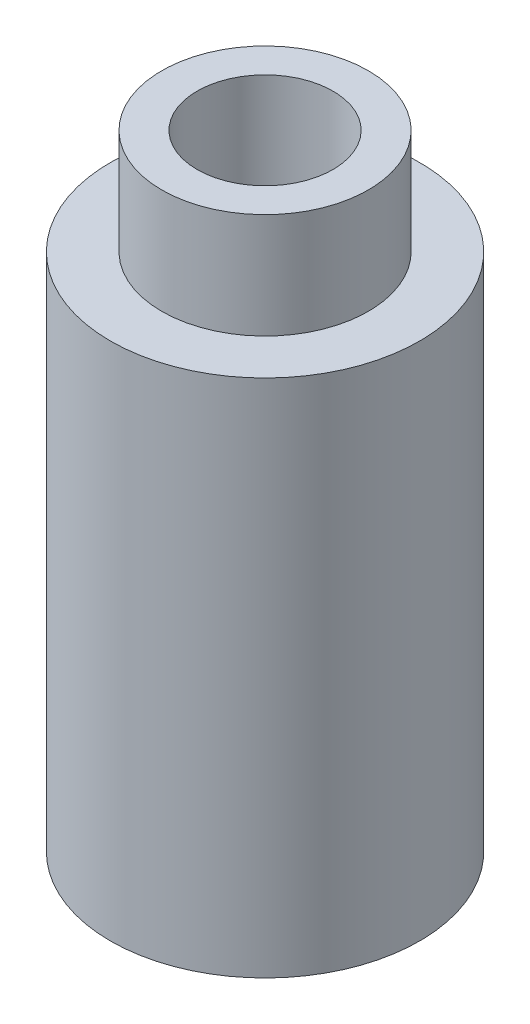
ISO-10303-21;
HEADER;
FILE_DESCRIPTION(('STEP AP214'),'2;1');
FILE_NAME('part.step','',(''),(''),'','','');
FILE_SCHEMA(('AUTOMOTIVE_DESIGN { 1 0 10303 214 1 1 1 1 }'));
ENDSEC;
DATA;
#1=APPLICATION_CONTEXT('core data for automotive mechanical design processes');
#2=APPLICATION_PROTOCOL_DEFINITION('international standard','automotive_design',2000,#1);
#3=PRODUCT_CONTEXT('',#1,'mechanical');
#4=PRODUCT('Part','Part','',(#3));
#5=PRODUCT_RELATED_PRODUCT_CATEGORY('part','',(#4));
#6=PRODUCT_DEFINITION_FORMATION('','',#4);
#7=PRODUCT_DEFINITION_CONTEXT('part definition',#1,'design');
#8=PRODUCT_DEFINITION('design','',#6,#7);
#9=PRODUCT_DEFINITION_SHAPE('','',#8);
#10=(LENGTH_UNIT() NAMED_UNIT(*) SI_UNIT(.MILLI.,.METRE.));
#11=(NAMED_UNIT(*) PLANE_ANGLE_UNIT() SI_UNIT($,.RADIAN.));
#12=(NAMED_UNIT(*) SI_UNIT($,.STERADIAN.) SOLID_ANGLE_UNIT());
#13=UNCERTAINTY_MEASURE_WITH_UNIT(LENGTH_MEASURE(1.E-05),#10,'distance_accuracy_value','');
#14=(GEOMETRIC_REPRESENTATION_CONTEXT(3) GLOBAL_UNCERTAINTY_ASSIGNED_CONTEXT((#13)) GLOBAL_UNIT_ASSIGNED_CONTEXT((#10,
#11,#12)) REPRESENTATION_CONTEXT('',''));
#15=CARTESIAN_POINT('',(0.,0.,0.));
#16=DIRECTION('',(0.,0.,1.));
#17=DIRECTION('',(1.,0.,0.));
#18=AXIS2_PLACEMENT_3D('',#15,#16,#17);
#19=CARTESIAN_POINT('',(0.,31.75,0.));
#20=DIRECTION('',(0.,1.,0.));
#21=DIRECTION('',(0.,0.,1.));
#22=AXIS2_PLACEMENT_3D('',#19,#20,#21);
#23=PLANE('',#22);
#24=CARTESIAN_POINT('',(0.,31.75,0.));
#25=DIRECTION('',(0.,1.,0.));
#26=DIRECTION('',(0.,0.,1.));
#27=AXIS2_PLACEMENT_3D('',#24,#25,#26);
#28=CIRCLE('',#27,9.4488);
#29=CARTESIAN_POINT('',(0.,31.75,9.4488));
#30=VERTEX_POINT('',#29);
#31=EDGE_CURVE('E10',#30,#30,#28,.T.);
#32=ORIENTED_EDGE('',*,*,#31,.T.);
#33=EDGE_LOOP('',(#32));
#34=FACE_BOUND('',#33,.T.);
#35=CARTESIAN_POINT('',(0.,31.75,0.));
#36=DIRECTION('',(0.,1.,0.));
#37=DIRECTION('',(0.,0.,1.));
#38=AXIS2_PLACEMENT_3D('',#35,#36,#37);
#39=CIRCLE('',#38,6.3119);
#40=CARTESIAN_POINT('',(0.,31.75,6.3119));
#41=VERTEX_POINT('',#40);
#42=EDGE_CURVE('E44',#41,#41,#39,.T.);
#43=ORIENTED_EDGE('',*,*,#42,.F.);
#44=EDGE_LOOP('',(#43));
#45=FACE_BOUND('',#44,.T.);
#46=ADVANCED_FACE('F31',(#34,#45),#23,.T.);
#47=CARTESIAN_POINT('',(0.,31.75,0.));
#48=DIRECTION('',(0.,-1.,0.));
#49=DIRECTION('',(0.,0.,-1.));
#50=AXIS2_PLACEMENT_3D('',#47,#48,#49);
#51=CYLINDRICAL_SURFACE('',#50,9.4488);
#52=ORIENTED_EDGE('',*,*,#31,.F.);
#53=EDGE_LOOP('',(#52));
#54=FACE_BOUND('',#53,.T.);
#55=CARTESIAN_POINT('',(0.,0.,0.));
#56=DIRECTION('',(0.,1.,0.));
#57=DIRECTION('',(0.,0.,1.));
#58=AXIS2_PLACEMENT_3D('',#55,#56,#57);
#59=CIRCLE('',#58,9.4488);
#60=CARTESIAN_POINT('',(0.,0.,9.4488));
#61=VERTEX_POINT('',#60);
#62=EDGE_CURVE('E35',#61,#61,#59,.T.);
#63=ORIENTED_EDGE('',*,*,#62,.T.);
#64=EDGE_LOOP('',(#63));
#65=FACE_BOUND('',#64,.T.);
#66=ADVANCED_FACE('F33',(#54,#65),#51,.T.);
#67=CARTESIAN_POINT('',(0.,0.,0.));
#68=DIRECTION('',(0.,1.,0.));
#69=DIRECTION('',(0.,0.,1.));
#70=AXIS2_PLACEMENT_3D('',#67,#68,#69);
#71=PLANE('',#70);
#72=CARTESIAN_POINT('',(0.,0.,0.));
#73=DIRECTION('',(0.,1.,0.));
#74=DIRECTION('',(0.,0.,1.));
#75=AXIS2_PLACEMENT_3D('',#72,#73,#74);
#76=CIRCLE('',#75,4.1529);
#77=CARTESIAN_POINT('',(0.,0.,4.1529));
#78=VERTEX_POINT('',#77);
#79=EDGE_CURVE('E47',#78,#78,#76,.T.);
#80=ORIENTED_EDGE('',*,*,#79,.T.);
#81=EDGE_LOOP('',(#80));
#82=FACE_BOUND('',#81,.T.);
#83=ORIENTED_EDGE('',*,*,#62,.F.);
#84=EDGE_LOOP('',(#83));
#85=FACE_BOUND('',#84,.T.);
#86=ADVANCED_FACE('F56',(#82,#85),#71,.F.);
#87=CARTESIAN_POINT('',(0.,38.1762,0.));
#88=DIRECTION('',(0.,-1.,0.));
#89=DIRECTION('',(0.,0.,-1.));
#90=AXIS2_PLACEMENT_3D('',#87,#88,#89);
#91=CYLINDRICAL_SURFACE('',#90,6.3119);
#92=CARTESIAN_POINT('',(0.,38.1762,0.));
#93=DIRECTION('',(0.,1.,0.));
#94=DIRECTION('',(0.,0.,1.));
#95=AXIS2_PLACEMENT_3D('',#92,#93,#94);
#96=CIRCLE('',#95,6.3119);
#97=CARTESIAN_POINT('',(0.,38.1762,6.3119));
#98=VERTEX_POINT('',#97);
#99=EDGE_CURVE('E42',#98,#98,#96,.T.);
#100=ORIENTED_EDGE('',*,*,#99,.F.);
#101=EDGE_LOOP('',(#100));
#102=FACE_BOUND('',#101,.T.);
#103=ORIENTED_EDGE('',*,*,#42,.T.);
#104=EDGE_LOOP('',(#103));
#105=FACE_BOUND('',#104,.T.);
#106=ADVANCED_FACE('F68',(#102,#105),#91,.T.);
#107=CARTESIAN_POINT('',(0.,38.1762,0.));
#108=DIRECTION('',(0.,1.,0.));
#109=DIRECTION('',(0.,0.,1.));
#110=AXIS2_PLACEMENT_3D('',#107,#108,#109);
#111=PLANE('',#110);
#112=CARTESIAN_POINT('',(0.,38.1762,0.));
#113=DIRECTION('',(0.,1.,0.));
#114=DIRECTION('',(0.,0.,1.));
#115=AXIS2_PLACEMENT_3D('',#112,#113,#114);
#116=CIRCLE('',#115,4.1529);
#117=CARTESIAN_POINT('',(0.,38.1762,4.1529));
#118=VERTEX_POINT('',#117);
#119=EDGE_CURVE('E50',#118,#118,#116,.T.);
#120=ORIENTED_EDGE('',*,*,#119,.F.);
#121=EDGE_LOOP('',(#120));
#122=FACE_BOUND('',#121,.T.);
#123=ORIENTED_EDGE('',*,*,#99,.T.);
#124=EDGE_LOOP('',(#123));
#125=FACE_BOUND('',#124,.T.);
#126=ADVANCED_FACE('F62',(#122,#125),#111,.T.);
#127=CARTESIAN_POINT('',(0.,0.,0.));
#128=DIRECTION('',(0.,1.,0.));
#129=DIRECTION('',(0.,0.,1.));
#130=AXIS2_PLACEMENT_3D('',#127,#128,#129);
#131=CYLINDRICAL_SURFACE('',#130,4.1529);
#132=ORIENTED_EDGE('',*,*,#79,.F.);
#133=EDGE_LOOP('',(#132));
#134=FACE_BOUND('',#133,.T.);
#135=ORIENTED_EDGE('',*,*,#119,.T.);
#136=EDGE_LOOP('',(#135));
#137=FACE_BOUND('',#136,.T.);
#138=ADVANCED_FACE('F59',(#134,#137),#131,.F.);
#139=CLOSED_SHELL('',(#46,#66,#86,#106,#126,#138));
#140=MANIFOLD_SOLID_BREP('B2',#139);
#141=ADVANCED_BREP_SHAPE_REPRESENTATION('',(#18,#140),#14);
#142=SHAPE_DEFINITION_REPRESENTATION(#9,#141);
ENDSEC;
END-ISO-10303-21;
